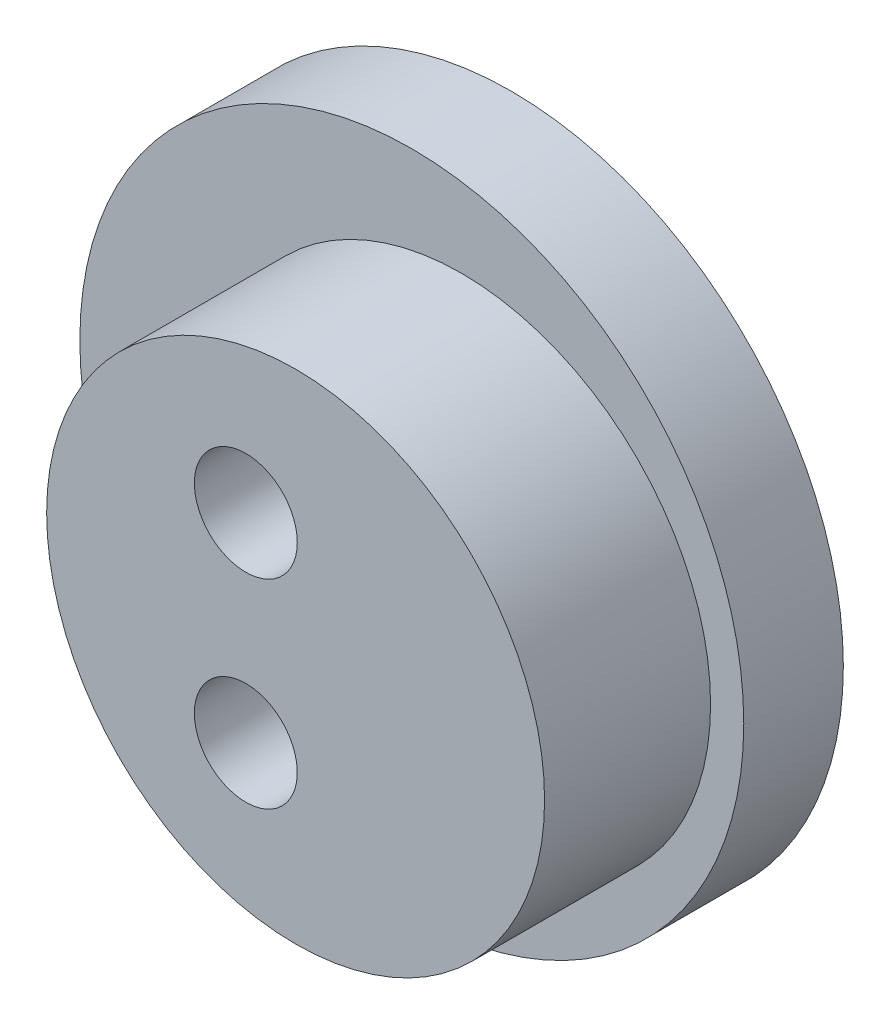
ISO-10303-21;
HEADER;
FILE_DESCRIPTION(('STEP AP214'),'2;1');
FILE_NAME('part.step','',(''),(''),'','','');
FILE_SCHEMA(('AUTOMOTIVE_DESIGN { 1 0 10303 214 1 1 1 1 }'));
ENDSEC;
DATA;
#1=APPLICATION_CONTEXT('core data for automotive mechanical design processes');
#2=APPLICATION_PROTOCOL_DEFINITION('international standard','automotive_design',2000,#1);
#3=PRODUCT_CONTEXT('',#1,'mechanical');
#4=PRODUCT('Part','Part','',(#3));
#5=PRODUCT_RELATED_PRODUCT_CATEGORY('part','',(#4));
#6=PRODUCT_DEFINITION_FORMATION('','',#4);
#7=PRODUCT_DEFINITION_CONTEXT('part definition',#1,'design');
#8=PRODUCT_DEFINITION('design','',#6,#7);
#9=PRODUCT_DEFINITION_SHAPE('','',#8);
#10=(LENGTH_UNIT() NAMED_UNIT(*) SI_UNIT(.MILLI.,.METRE.));
#11=(NAMED_UNIT(*) PLANE_ANGLE_UNIT() SI_UNIT($,.RADIAN.));
#12=(NAMED_UNIT(*) SI_UNIT($,.STERADIAN.) SOLID_ANGLE_UNIT());
#13=UNCERTAINTY_MEASURE_WITH_UNIT(LENGTH_MEASURE(1.E-05),#10,'distance_accuracy_value','');
#14=(GEOMETRIC_REPRESENTATION_CONTEXT(3) GLOBAL_UNCERTAINTY_ASSIGNED_CONTEXT((#13)) GLOBAL_UNIT_ASSIGNED_CONTEXT((#10,
#11,#12)) REPRESENTATION_CONTEXT('',''));
#15=CARTESIAN_POINT('',(0.,0.,0.));
#16=DIRECTION('',(0.,0.,1.));
#17=DIRECTION('',(1.,0.,0.));
#18=AXIS2_PLACEMENT_3D('',#15,#16,#17);
#19=CARTESIAN_POINT('',(0.,0.,3.));
#20=DIRECTION('',(0.,0.,-1.));
#21=DIRECTION('',(-1.,0.,0.));
#22=AXIS2_PLACEMENT_3D('',#19,#20,#21);
#23=CYLINDRICAL_SURFACE('',#22,10.);
#24=CARTESIAN_POINT('',(0.,0.,3.));
#25=DIRECTION('',(0.,0.,1.));
#26=DIRECTION('',(1.,0.,0.));
#27=AXIS2_PLACEMENT_3D('',#24,#25,#26);
#28=CIRCLE('',#27,10.);
#29=CARTESIAN_POINT('',(10.,0.,3.));
#30=VERTEX_POINT('',#29);
#31=EDGE_CURVE('E47',#30,#30,#28,.T.);
#32=ORIENTED_EDGE('',*,*,#31,.F.);
#33=EDGE_LOOP('',(#32));
#34=FACE_BOUND('',#33,.T.);
#35=CARTESIAN_POINT('',(0.,0.,0.));
#36=DIRECTION('',(0.,0.,1.));
#37=DIRECTION('',(1.,0.,0.));
#38=AXIS2_PLACEMENT_3D('',#35,#36,#37);
#39=CIRCLE('',#38,10.);
#40=CARTESIAN_POINT('',(10.,0.,0.));
#41=VERTEX_POINT('',#40);
#42=EDGE_CURVE('E42',#41,#41,#39,.T.);
#43=ORIENTED_EDGE('',*,*,#42,.T.);
#44=EDGE_LOOP('',(#43));
#45=FACE_BOUND('',#44,.T.);
#46=ADVANCED_FACE('F39',(#34,#45),#23,.T.);
#47=CARTESIAN_POINT('',(0.,0.,3.));
#48=DIRECTION('',(0.,0.,1.));
#49=DIRECTION('',(1.,0.,0.));
#50=AXIS2_PLACEMENT_3D('',#47,#48,#49);
#51=PLANE('',#50);
#52=CARTESIAN_POINT('',(1.5,0.,3.));
#53=DIRECTION('',(0.,0.,1.));
#54=DIRECTION('',(1.,0.,0.));
#55=AXIS2_PLACEMENT_3D('',#52,#53,#54);
#56=CIRCLE('',#55,7.5);
#57=CARTESIAN_POINT('',(9.,0.,3.));
#58=VERTEX_POINT('',#57);
#59=EDGE_CURVE('E10',#58,#58,#56,.T.);
#60=ORIENTED_EDGE('',*,*,#59,.F.);
#61=EDGE_LOOP('',(#60));
#62=FACE_BOUND('',#61,.T.);
#63=ORIENTED_EDGE('',*,*,#31,.T.);
#64=EDGE_LOOP('',(#63));
#65=FACE_BOUND('',#64,.T.);
#66=ADVANCED_FACE('F99',(#62,#65),#51,.T.);
#67=CARTESIAN_POINT('',(0.,0.,0.));
#68=DIRECTION('',(0.,0.,1.));
#69=DIRECTION('',(1.,0.,0.));
#70=AXIS2_PLACEMENT_3D('',#67,#68,#69);
#71=PLANE('',#70);
#72=CARTESIAN_POINT('',(0.,3.,0.));
#73=DIRECTION('',(0.,0.,1.));
#74=DIRECTION('',(1.,0.,0.));
#75=AXIS2_PLACEMENT_3D('',#72,#73,#74);
#76=CIRCLE('',#75,1.55);
#77=CARTESIAN_POINT('',(1.55,3.,0.));
#78=VERTEX_POINT('',#77);
#79=EDGE_CURVE('E58',#78,#78,#76,.T.);
#80=ORIENTED_EDGE('',*,*,#79,.T.);
#81=EDGE_LOOP('',(#80));
#82=FACE_BOUND('',#81,.T.);
#83=CARTESIAN_POINT('',(0.,-3.,0.));
#84=DIRECTION('',(0.,0.,1.));
#85=DIRECTION('',(-1.,0.,0.));
#86=AXIS2_PLACEMENT_3D('',#83,#84,#85);
#87=CIRCLE('',#86,1.55);
#88=CARTESIAN_POINT('',(-1.55,-3.,0.));
#89=VERTEX_POINT('',#88);
#90=EDGE_CURVE('E63',#89,#89,#87,.T.);
#91=ORIENTED_EDGE('',*,*,#90,.T.);
#92=EDGE_LOOP('',(#91));
#93=FACE_BOUND('',#92,.T.);
#94=ORIENTED_EDGE('',*,*,#42,.F.);
#95=EDGE_LOOP('',(#94));
#96=FACE_BOUND('',#95,.T.);
#97=ADVANCED_FACE('F75',(#82,#93,#96),#71,.F.);
#98=CARTESIAN_POINT('',(1.5,0.,8.));
#99=DIRECTION('',(0.,0.,-1.));
#100=DIRECTION('',(-1.,0.,0.));
#101=AXIS2_PLACEMENT_3D('',#98,#99,#100);
#102=CYLINDRICAL_SURFACE('',#101,7.5);
#103=CARTESIAN_POINT('',(1.5,0.,8.));
#104=DIRECTION('',(0.,0.,1.));
#105=DIRECTION('',(1.,0.,0.));
#106=AXIS2_PLACEMENT_3D('',#103,#104,#105);
#107=CIRCLE('',#106,7.5);
#108=CARTESIAN_POINT('',(9.,0.,8.));
#109=VERTEX_POINT('',#108);
#110=EDGE_CURVE('E54',#109,#109,#107,.T.);
#111=ORIENTED_EDGE('',*,*,#110,.F.);
#112=EDGE_LOOP('',(#111));
#113=FACE_BOUND('',#112,.T.);
#114=ORIENTED_EDGE('',*,*,#59,.T.);
#115=EDGE_LOOP('',(#114));
#116=FACE_BOUND('',#115,.T.);
#117=ADVANCED_FACE('F88',(#113,#116),#102,.T.);
#118=CARTESIAN_POINT('',(1.5,0.,8.));
#119=DIRECTION('',(0.,0.,1.));
#120=DIRECTION('',(1.,0.,0.));
#121=AXIS2_PLACEMENT_3D('',#118,#119,#120);
#122=PLANE('',#121);
#123=CARTESIAN_POINT('',(0.,3.,8.));
#124=DIRECTION('',(0.,0.,1.));
#125=DIRECTION('',(1.,0.,0.));
#126=AXIS2_PLACEMENT_3D('',#123,#124,#125);
#127=CIRCLE('',#126,1.55);
#128=CARTESIAN_POINT('',(1.55,3.,8.));
#129=VERTEX_POINT('',#128);
#130=EDGE_CURVE('E67',#129,#129,#127,.T.);
#131=ORIENTED_EDGE('',*,*,#130,.F.);
#132=EDGE_LOOP('',(#131));
#133=FACE_BOUND('',#132,.T.);
#134=CARTESIAN_POINT('',(0.,-3.,8.));
#135=DIRECTION('',(0.,0.,1.));
#136=DIRECTION('',(-1.,0.,0.));
#137=AXIS2_PLACEMENT_3D('',#134,#135,#136);
#138=CIRCLE('',#137,1.55);
#139=CARTESIAN_POINT('',(-1.55,-3.,8.));
#140=VERTEX_POINT('',#139);
#141=EDGE_CURVE('E59',#140,#140,#138,.T.);
#142=ORIENTED_EDGE('',*,*,#141,.F.);
#143=EDGE_LOOP('',(#142));
#144=FACE_BOUND('',#143,.T.);
#145=ORIENTED_EDGE('',*,*,#110,.T.);
#146=EDGE_LOOP('',(#145));
#147=FACE_BOUND('',#146,.T.);
#148=ADVANCED_FACE('F85',(#133,#144,#147),#122,.T.);
#149=CARTESIAN_POINT('',(0.,-3.,0.));
#150=DIRECTION('',(0.,0.,1.));
#151=DIRECTION('',(1.,0.,0.));
#152=AXIS2_PLACEMENT_3D('',#149,#150,#151);
#153=CYLINDRICAL_SURFACE('',#152,1.55);
#154=ORIENTED_EDGE('',*,*,#90,.F.);
#155=EDGE_LOOP('',(#154));
#156=FACE_BOUND('',#155,.T.);
#157=ORIENTED_EDGE('',*,*,#141,.T.);
#158=EDGE_LOOP('',(#157));
#159=FACE_BOUND('',#158,.T.);
#160=ADVANCED_FACE('F81',(#156,#159),#153,.F.);
#161=CARTESIAN_POINT('',(0.,3.,0.));
#162=DIRECTION('',(0.,0.,1.));
#163=DIRECTION('',(1.,0.,0.));
#164=AXIS2_PLACEMENT_3D('',#161,#162,#163);
#165=CYLINDRICAL_SURFACE('',#164,1.55);
#166=ORIENTED_EDGE('',*,*,#79,.F.);
#167=EDGE_LOOP('',(#166));
#168=FACE_BOUND('',#167,.T.);
#169=ORIENTED_EDGE('',*,*,#130,.T.);
#170=EDGE_LOOP('',(#169));
#171=FACE_BOUND('',#170,.T.);
#172=ADVANCED_FACE('F78',(#168,#171),#165,.F.);
#173=CLOSED_SHELL('',(#46,#66,#97,#117,#148,#160,#172));
#174=MANIFOLD_SOLID_BREP('B2',#173);
#175=ADVANCED_BREP_SHAPE_REPRESENTATION('',(#18,#174),#14);
#176=SHAPE_DEFINITION_REPRESENTATION(#9,#175);
ENDSEC;
END-ISO-10303-21;
